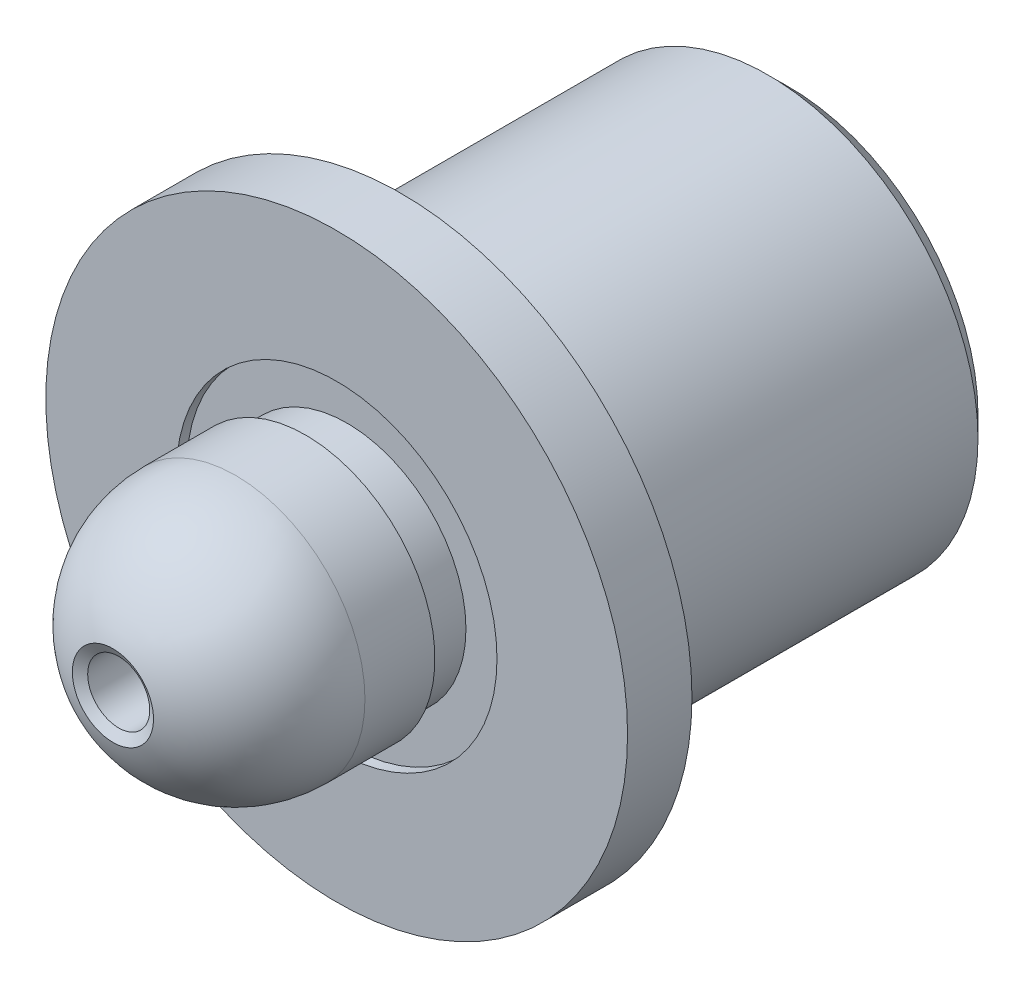
ISO-10303-21;
HEADER;
FILE_DESCRIPTION(('STEP AP214'),'2;1');
FILE_NAME('part.step','',(''),(''),'','','');
FILE_SCHEMA(('AUTOMOTIVE_DESIGN { 1 0 10303 214 1 1 1 1 }'));
ENDSEC;
DATA;
#1=APPLICATION_CONTEXT('core data for automotive mechanical design processes');
#2=APPLICATION_PROTOCOL_DEFINITION('international standard','automotive_design',2000,#1);
#3=PRODUCT_CONTEXT('',#1,'mechanical');
#4=PRODUCT('Part','Part','',(#3));
#5=PRODUCT_RELATED_PRODUCT_CATEGORY('part','',(#4));
#6=PRODUCT_DEFINITION_FORMATION('','',#4);
#7=PRODUCT_DEFINITION_CONTEXT('part definition',#1,'design');
#8=PRODUCT_DEFINITION('design','',#6,#7);
#9=PRODUCT_DEFINITION_SHAPE('','',#8);
#10=(LENGTH_UNIT() NAMED_UNIT(*) SI_UNIT(.MILLI.,.METRE.));
#11=(NAMED_UNIT(*) PLANE_ANGLE_UNIT() SI_UNIT($,.RADIAN.));
#12=(NAMED_UNIT(*) SI_UNIT($,.STERADIAN.) SOLID_ANGLE_UNIT());
#13=UNCERTAINTY_MEASURE_WITH_UNIT(LENGTH_MEASURE(1.E-05),#10,'distance_accuracy_value','');
#14=(GEOMETRIC_REPRESENTATION_CONTEXT(3) GLOBAL_UNCERTAINTY_ASSIGNED_CONTEXT((#13)) GLOBAL_UNIT_ASSIGNED_CONTEXT((#10,
#11,#12)) REPRESENTATION_CONTEXT('',''));
#15=CARTESIAN_POINT('',(0.,0.,0.));
#16=DIRECTION('',(0.,0.,1.));
#17=DIRECTION('',(1.,0.,0.));
#18=AXIS2_PLACEMENT_3D('',#15,#16,#17);
#19=CARTESIAN_POINT('',(0.,0.,13.5865460807241));
#20=DIRECTION('',(0.,0.,1.));
#21=DIRECTION('',(0.,1.,0.));
#22=AXIS2_PLACEMENT_3D('',#19,#20,#21);
#23=SPHERICAL_SURFACE('',#22,3.175);
#24=CARTESIAN_POINT('',(0.,0.,16.6008963569466));
#25=DIRECTION('',(0.,0.,-1.));
#26=DIRECTION('',(-1.,0.,0.));
#27=AXIS2_PLACEMENT_3D('',#24,#25,#26);
#28=CIRCLE('',#27,0.997154658133342);
#29=CARTESIAN_POINT('',(-0.997154658133342,0.,16.6008963569466));
#30=VERTEX_POINT('',#29);
#31=EDGE_CURVE('E10',#30,#30,#28,.T.);
#32=ORIENTED_EDGE('',*,*,#31,.T.);
#33=EDGE_LOOP('',(#32));
#34=FACE_BOUND('',#33,.T.);
#35=CARTESIAN_POINT('',(0.,0.,13.5865460807241));
#36=DIRECTION('',(0.,0.,1.));
#37=DIRECTION('',(1.,0.,0.));
#38=AXIS2_PLACEMENT_3D('',#35,#36,#37);
#39=CIRCLE('',#38,3.175);
#40=CARTESIAN_POINT('',(3.175,0.,13.5865460807241));
#41=VERTEX_POINT('',#40);
#42=EDGE_CURVE('E70',#41,#41,#39,.T.);
#43=ORIENTED_EDGE('',*,*,#42,.T.);
#44=EDGE_LOOP('',(#43));
#45=FACE_BOUND('',#44,.T.);
#46=ADVANCED_FACE('F32',(#34,#45),#23,.T.);
#47=CARTESIAN_POINT('',(0.,5.159375,9.525));
#48=DIRECTION('',(0.,0.,1.));
#49=DIRECTION('',(1.,0.,0.));
#50=AXIS2_PLACEMENT_3D('',#47,#48,#49);
#51=PLANE('',#50);
#52=CARTESIAN_POINT('',(0.,0.,9.525));
#53=DIRECTION('',(0.,0.,1.));
#54=DIRECTION('',(1.,0.,0.));
#55=AXIS2_PLACEMENT_3D('',#52,#53,#54);
#56=CIRCLE('',#55,7.14375);
#57=CARTESIAN_POINT('',(7.14375,0.,9.525));
#58=VERTEX_POINT('',#57);
#59=EDGE_CURVE('E58',#58,#58,#56,.T.);
#60=ORIENTED_EDGE('',*,*,#59,.F.);
#61=EDGE_LOOP('',(#60));
#62=FACE_BOUND('',#61,.T.);
#63=CARTESIAN_POINT('',(0.,0.,9.525));
#64=DIRECTION('',(0.,0.,1.));
#65=DIRECTION('',(1.,0.,0.));
#66=AXIS2_PLACEMENT_3D('',#63,#64,#65);
#67=CIRCLE('',#66,5.921375);
#68=CARTESIAN_POINT('',(5.921375,0.,9.525));
#69=VERTEX_POINT('',#68);
#70=EDGE_CURVE('E63',#69,#69,#67,.F.);
#71=ORIENTED_EDGE('',*,*,#70,.F.);
#72=EDGE_LOOP('',(#71));
#73=FACE_BOUND('',#72,.T.);
#74=ADVANCED_FACE('F118',(#62,#73),#51,.F.);
#75=CARTESIAN_POINT('',(0.,7.14375,11.10615));
#76=DIRECTION('',(0.,0.,-1.));
#77=DIRECTION('',(-1.,0.,0.));
#78=AXIS2_PLACEMENT_3D('',#75,#76,#77);
#79=PLANE('',#78);
#80=CARTESIAN_POINT('',(0.,0.,11.10615));
#81=DIRECTION('',(0.,0.,1.));
#82=DIRECTION('',(1.,0.,0.));
#83=AXIS2_PLACEMENT_3D('',#80,#81,#82);
#84=CIRCLE('',#83,7.14375);
#85=CARTESIAN_POINT('',(7.14375,0.,11.10615));
#86=VERTEX_POINT('',#85);
#87=EDGE_CURVE('E77',#86,#86,#84,.T.);
#88=ORIENTED_EDGE('',*,*,#87,.T.);
#89=EDGE_LOOP('',(#88));
#90=FACE_BOUND('',#89,.T.);
#91=CARTESIAN_POINT('',(0.,0.,11.10615));
#92=DIRECTION('',(0.,0.,-1.));
#93=DIRECTION('',(-1.,0.,0.));
#94=AXIS2_PLACEMENT_3D('',#91,#92,#93);
#95=CIRCLE('',#94,3.937);
#96=CARTESIAN_POINT('',(-3.937,0.,11.10615));
#97=VERTEX_POINT('',#96);
#98=EDGE_CURVE('E67',#97,#97,#95,.F.);
#99=ORIENTED_EDGE('',*,*,#98,.F.);
#100=EDGE_LOOP('',(#99));
#101=FACE_BOUND('',#100,.T.);
#102=ADVANCED_FACE('F123',(#90,#101),#79,.F.);
#103=CARTESIAN_POINT('',(0.,0.,17.4309411747939));
#104=DIRECTION('',(0.,0.,1.));
#105=DIRECTION('',(1.,0.,0.));
#106=AXIS2_PLACEMENT_3D('',#103,#104,#105);
#107=CYLINDRICAL_SURFACE('',#106,7.14375);
#108=ORIENTED_EDGE('',*,*,#87,.F.);
#109=EDGE_LOOP('',(#108));
#110=FACE_BOUND('',#109,.T.);
#111=ORIENTED_EDGE('',*,*,#59,.T.);
#112=EDGE_LOOP('',(#111));
#113=FACE_BOUND('',#112,.T.);
#114=ADVANCED_FACE('F139',(#110,#113),#107,.T.);
#115=CARTESIAN_POINT('',(0.,0.,17.4309411747939));
#116=DIRECTION('',(0.,0.,1.));
#117=DIRECTION('',(1.,0.,0.));
#118=AXIS2_PLACEMENT_3D('',#115,#116,#117);
#119=CYLINDRICAL_SURFACE('',#118,3.937);
#120=CARTESIAN_POINT('',(0.,0.,10.85215));
#121=DIRECTION('',(0.,0.,1.));
#122=DIRECTION('',(1.,0.,0.));
#123=AXIS2_PLACEMENT_3D('',#120,#121,#122);
#124=CIRCLE('',#123,3.937);
#125=CARTESIAN_POINT('',(3.937,0.,10.85215));
#126=VERTEX_POINT('',#125);
#127=EDGE_CURVE('E74',#126,#126,#124,.T.);
#128=ORIENTED_EDGE('',*,*,#127,.F.);
#129=EDGE_LOOP('',(#128));
#130=FACE_BOUND('',#129,.T.);
#131=ORIENTED_EDGE('',*,*,#98,.T.);
#132=EDGE_LOOP('',(#131));
#133=FACE_BOUND('',#132,.T.);
#134=ADVANCED_FACE('F142',(#130,#133),#119,.F.);
#135=CARTESIAN_POINT('',(0.,2.921,11.86815));
#136=DIRECTION('',(0.,0.,-1.));
#137=DIRECTION('',(-1.,0.,0.));
#138=AXIS2_PLACEMENT_3D('',#135,#136,#137);
#139=PLANE('',#138);
#140=CARTESIAN_POINT('',(0.,0.,11.86815));
#141=DIRECTION('',(0.,0.,1.));
#142=DIRECTION('',(1.,0.,0.));
#143=AXIS2_PLACEMENT_3D('',#140,#141,#142);
#144=CIRCLE('',#143,2.921);
#145=CARTESIAN_POINT('',(2.921,0.,11.86815));
#146=VERTEX_POINT('',#145);
#147=EDGE_CURVE('E62',#146,#146,#144,.T.);
#148=ORIENTED_EDGE('',*,*,#147,.T.);
#149=EDGE_LOOP('',(#148));
#150=FACE_BOUND('',#149,.T.);
#151=CARTESIAN_POINT('',(0.,0.,11.86815));
#152=DIRECTION('',(0.,0.,-1.));
#153=DIRECTION('',(-1.,0.,0.));
#154=AXIS2_PLACEMENT_3D('',#151,#152,#153);
#155=CIRCLE('',#154,3.175);
#156=CARTESIAN_POINT('',(-3.175,0.,11.86815));
#157=VERTEX_POINT('',#156);
#158=EDGE_CURVE('E71',#157,#157,#155,.T.);
#159=ORIENTED_EDGE('',*,*,#158,.T.);
#160=EDGE_LOOP('',(#159));
#161=FACE_BOUND('',#160,.T.);
#162=ADVANCED_FACE('F129',(#150,#161),#139,.T.);
#163=CARTESIAN_POINT('',(0.,2.921,10.85215));
#164=DIRECTION('',(0.,0.,1.));
#165=DIRECTION('',(1.,0.,0.));
#166=AXIS2_PLACEMENT_3D('',#163,#164,#165);
#167=PLANE('',#166);
#168=ORIENTED_EDGE('',*,*,#127,.T.);
#169=EDGE_LOOP('',(#168));
#170=FACE_BOUND('',#169,.T.);
#171=CARTESIAN_POINT('',(0.,0.,10.85215));
#172=DIRECTION('',(0.,0.,1.));
#173=DIRECTION('',(1.,0.,0.));
#174=AXIS2_PLACEMENT_3D('',#171,#172,#173);
#175=CIRCLE('',#174,2.921);
#176=CARTESIAN_POINT('',(2.921,0.,10.85215));
#177=VERTEX_POINT('',#176);
#178=EDGE_CURVE('E84',#177,#177,#175,.T.);
#179=ORIENTED_EDGE('',*,*,#178,.F.);
#180=EDGE_LOOP('',(#179));
#181=FACE_BOUND('',#180,.T.);
#182=ADVANCED_FACE('F189',(#170,#181),#167,.T.);
#183=CARTESIAN_POINT('',(0.,0.,17.4309411747939));
#184=DIRECTION('',(0.,0.,1.));
#185=DIRECTION('',(1.,0.,0.));
#186=AXIS2_PLACEMENT_3D('',#183,#184,#185);
#187=CYLINDRICAL_SURFACE('',#186,2.921);
#188=ORIENTED_EDGE('',*,*,#178,.T.);
#189=EDGE_LOOP('',(#188));
#190=FACE_BOUND('',#189,.T.);
#191=ORIENTED_EDGE('',*,*,#147,.F.);
#192=EDGE_LOOP('',(#191));
#193=FACE_BOUND('',#192,.T.);
#194=ADVANCED_FACE('F135',(#190,#193),#187,.T.);
#195=CARTESIAN_POINT('',(0.,0.,17.4309411747939));
#196=DIRECTION('',(0.,0.,1.));
#197=DIRECTION('',(1.,0.,0.));
#198=AXIS2_PLACEMENT_3D('',#195,#196,#197);
#199=CYLINDRICAL_SURFACE('',#198,3.175);
#200=ORIENTED_EDGE('',*,*,#42,.F.);
#201=EDGE_LOOP('',(#200));
#202=FACE_BOUND('',#201,.T.);
#203=ORIENTED_EDGE('',*,*,#158,.F.);
#204=EDGE_LOOP('',(#203));
#205=FACE_BOUND('',#204,.T.);
#206=ADVANCED_FACE('F131',(#202,#205),#199,.T.);
#207=CARTESIAN_POINT('',(0.,5.921375,8.763));
#208=DIRECTION('',(0.,0.,1.));
#209=DIRECTION('',(1.,0.,0.));
#210=AXIS2_PLACEMENT_3D('',#207,#208,#209);
#211=PLANE('',#210);
#212=CARTESIAN_POINT('',(0.,0.,8.763));
#213=DIRECTION('',(0.,0.,1.));
#214=DIRECTION('',(1.,0.,0.));
#215=AXIS2_PLACEMENT_3D('',#212,#213,#214);
#216=CIRCLE('',#215,4.905375);
#217=CARTESIAN_POINT('',(4.905375,0.,8.763));
#218=VERTEX_POINT('',#217);
#219=EDGE_CURVE('E91',#218,#218,#216,.T.);
#220=ORIENTED_EDGE('',*,*,#219,.F.);
#221=EDGE_LOOP('',(#220));
#222=FACE_BOUND('',#221,.T.);
#223=CARTESIAN_POINT('',(0.,0.,8.763));
#224=DIRECTION('',(0.,0.,1.));
#225=DIRECTION('',(1.,0.,0.));
#226=AXIS2_PLACEMENT_3D('',#223,#224,#225);
#227=CIRCLE('',#226,5.159375);
#228=CARTESIAN_POINT('',(5.159375,0.,8.763));
#229=VERTEX_POINT('',#228);
#230=EDGE_CURVE('E59',#229,#229,#227,.T.);
#231=ORIENTED_EDGE('',*,*,#230,.T.);
#232=EDGE_LOOP('',(#231));
#233=FACE_BOUND('',#232,.T.);
#234=ADVANCED_FACE('F134',(#222,#233),#211,.T.);
#235=CARTESIAN_POINT('',(0.,0.,17.4309411747939));
#236=DIRECTION('',(0.,0.,1.));
#237=DIRECTION('',(1.,0.,0.));
#238=AXIS2_PLACEMENT_3D('',#235,#236,#237);
#239=CYLINDRICAL_SURFACE('',#238,5.921375);
#240=CARTESIAN_POINT('',(0.,0.,9.779));
#241=DIRECTION('',(0.,0.,1.));
#242=DIRECTION('',(1.,0.,0.));
#243=AXIS2_PLACEMENT_3D('',#240,#241,#242);
#244=CIRCLE('',#243,5.921375);
#245=CARTESIAN_POINT('',(5.921375,0.,9.779));
#246=VERTEX_POINT('',#245);
#247=EDGE_CURVE('E94',#246,#246,#244,.T.);
#248=ORIENTED_EDGE('',*,*,#247,.T.);
#249=EDGE_LOOP('',(#248));
#250=FACE_BOUND('',#249,.T.);
#251=ORIENTED_EDGE('',*,*,#70,.T.);
#252=EDGE_LOOP('',(#251));
#253=FACE_BOUND('',#252,.T.);
#254=ADVANCED_FACE('F170',(#250,#253),#239,.F.);
#255=CARTESIAN_POINT('',(0.,5.921375,9.779));
#256=DIRECTION('',(0.,0.,-1.));
#257=DIRECTION('',(-1.,0.,0.));
#258=AXIS2_PLACEMENT_3D('',#255,#256,#257);
#259=PLANE('',#258);
#260=CARTESIAN_POINT('',(0.,0.,9.779));
#261=DIRECTION('',(0.,0.,1.));
#262=DIRECTION('',(1.,0.,0.));
#263=AXIS2_PLACEMENT_3D('',#260,#261,#262);
#264=CIRCLE('',#263,4.905375);
#265=CARTESIAN_POINT('',(4.905375,0.,9.779));
#266=VERTEX_POINT('',#265);
#267=EDGE_CURVE('E66',#266,#266,#264,.T.);
#268=ORIENTED_EDGE('',*,*,#267,.T.);
#269=EDGE_LOOP('',(#268));
#270=FACE_BOUND('',#269,.T.);
#271=ORIENTED_EDGE('',*,*,#247,.F.);
#272=EDGE_LOOP('',(#271));
#273=FACE_BOUND('',#272,.T.);
#274=ADVANCED_FACE('F176',(#270,#273),#259,.T.);
#275=CARTESIAN_POINT('',(0.,0.,17.4309411747939));
#276=DIRECTION('',(0.,0.,1.));
#277=DIRECTION('',(1.,0.,0.));
#278=AXIS2_PLACEMENT_3D('',#275,#276,#277);
#279=CYLINDRICAL_SURFACE('',#278,4.905375);
#280=ORIENTED_EDGE('',*,*,#219,.T.);
#281=EDGE_LOOP('',(#280));
#282=FACE_BOUND('',#281,.T.);
#283=ORIENTED_EDGE('',*,*,#267,.F.);
#284=EDGE_LOOP('',(#283));
#285=FACE_BOUND('',#284,.T.);
#286=ADVANCED_FACE('F153',(#282,#285),#279,.T.);
#287=CARTESIAN_POINT('',(0.,0.,0.));
#288=DIRECTION('',(0.,0.,1.));
#289=DIRECTION('',(1.,0.,0.));
#290=AXIS2_PLACEMENT_3D('',#287,#288,#289);
#291=PLANE('',#290);
#292=CARTESIAN_POINT('',(0.,0.,0.));
#293=DIRECTION('',(0.,0.,1.));
#294=DIRECTION('',(1.,0.,0.));
#295=AXIS2_PLACEMENT_3D('',#292,#293,#294);
#296=CIRCLE('',#295,1.016);
#297=CARTESIAN_POINT('',(-1.016,0.,0.));
#298=VERTEX_POINT('',#297);
#299=EDGE_CURVE('E43',#298,#298,#296,.T.);
#300=ORIENTED_EDGE('',*,*,#299,.T.);
#301=EDGE_LOOP('',(#300));
#302=FACE_BOUND('',#301,.T.);
#303=CARTESIAN_POINT('',(0.,0.,0.));
#304=DIRECTION('',(0.,0.,1.));
#305=DIRECTION('',(1.,0.,0.));
#306=AXIS2_PLACEMENT_3D('',#303,#304,#305);
#307=CIRCLE('',#306,4.6434375);
#308=CARTESIAN_POINT('',(4.6434375,0.,0.));
#309=VERTEX_POINT('',#308);
#310=EDGE_CURVE('E52',#309,#309,#307,.F.);
#311=ORIENTED_EDGE('',*,*,#310,.T.);
#312=EDGE_LOOP('',(#311));
#313=FACE_BOUND('',#312,.T.);
#314=ADVANCED_FACE('F149',(#302,#313),#291,.F.);
#315=CARTESIAN_POINT('',(0.,0.,17.4309411747939));
#316=DIRECTION('',(0.,0.,1.));
#317=DIRECTION('',(1.,0.,0.));
#318=AXIS2_PLACEMENT_3D('',#315,#316,#317);
#319=CYLINDRICAL_SURFACE('',#318,5.159375);
#320=CARTESIAN_POINT('',(0.,0.,0.515937499999997));
#321=DIRECTION('',(0.,0.,1.));
#322=DIRECTION('',(1.,0.,0.));
#323=AXIS2_PLACEMENT_3D('',#320,#321,#322);
#324=CIRCLE('',#323,5.159375);
#325=CARTESIAN_POINT('',(5.159375,0.,0.515937499999997));
#326=VERTEX_POINT('',#325);
#327=EDGE_CURVE('E55',#326,#326,#324,.T.);
#328=ORIENTED_EDGE('',*,*,#327,.T.);
#329=EDGE_LOOP('',(#328));
#330=FACE_BOUND('',#329,.T.);
#331=ORIENTED_EDGE('',*,*,#230,.F.);
#332=EDGE_LOOP('',(#331));
#333=FACE_BOUND('',#332,.T.);
#334=ADVANCED_FACE('F145',(#330,#333),#319,.T.);
#335=CARTESIAN_POINT('',(0.,0.,0.515937499999997));
#336=DIRECTION('',(0.,0.,1.));
#337=DIRECTION('',(1.,0.,0.));
#338=AXIS2_PLACEMENT_3D('',#335,#336,#337);
#339=CONICAL_SURFACE('',#338,5.159375,0.785398163397449);
#340=ORIENTED_EDGE('',*,*,#310,.F.);
#341=EDGE_LOOP('',(#340));
#342=FACE_BOUND('',#341,.T.);
#343=ORIENTED_EDGE('',*,*,#327,.F.);
#344=EDGE_LOOP('',(#343));
#345=FACE_BOUND('',#344,.T.);
#346=ADVANCED_FACE('F148',(#342,#345),#339,.T.);
#347=CARTESIAN_POINT('',(0.,0.,2.54));
#348=DIRECTION('',(0.,0.,-1.));
#349=DIRECTION('',(-1.,0.,0.));
#350=AXIS2_PLACEMENT_3D('',#347,#348,#349);
#351=CYLINDRICAL_SURFACE('',#350,0.762);
#352=CARTESIAN_POINT('',(0.,0.,0.254000000000002));
#353=DIRECTION('',(0.,0.,1.));
#354=DIRECTION('',(1.,0.,0.));
#355=AXIS2_PLACEMENT_3D('',#352,#353,#354);
#356=CIRCLE('',#355,0.762);
#357=CARTESIAN_POINT('',(-0.762,0.,0.254000000000002));
#358=VERTEX_POINT('',#357);
#359=EDGE_CURVE('E47',#358,#358,#356,.F.);
#360=ORIENTED_EDGE('',*,*,#359,.T.);
#361=EDGE_LOOP('',(#360));
#362=FACE_BOUND('',#361,.T.);
#363=CARTESIAN_POINT('',(0.,0.,2.54));
#364=DIRECTION('',(0.,0.,-1.));
#365=DIRECTION('',(-1.,0.,0.));
#366=AXIS2_PLACEMENT_3D('',#363,#364,#365);
#367=CIRCLE('',#366,0.762);
#368=CARTESIAN_POINT('',(-0.762,0.,2.54));
#369=VERTEX_POINT('',#368);
#370=EDGE_CURVE('E97',#369,#369,#367,.T.);
#371=ORIENTED_EDGE('',*,*,#370,.F.);
#372=EDGE_LOOP('',(#371));
#373=FACE_BOUND('',#372,.T.);
#374=ADVANCED_FACE('F156',(#362,#373),#351,.F.);
#375=CARTESIAN_POINT('',(0.,0.,2.54));
#376=DIRECTION('',(0.,0.,-1.));
#377=DIRECTION('',(-1.,0.,0.));
#378=AXIS2_PLACEMENT_3D('',#375,#376,#377);
#379=PLANE('',#378);
#380=ORIENTED_EDGE('',*,*,#370,.T.);
#381=EDGE_LOOP('',(#380));
#382=FACE_BOUND('',#381,.T.);
#383=ADVANCED_FACE('F115',(#382),#379,.T.);
#384=CARTESIAN_POINT('',(0.,0.,14.2215460807241));
#385=DIRECTION('',(0.,0.,1.));
#386=DIRECTION('',(1.,0.,0.));
#387=AXIS2_PLACEMENT_3D('',#384,#385,#386);
#388=CYLINDRICAL_SURFACE('',#387,0.762);
#389=CARTESIAN_POINT('',(0.,0.,16.4589666438268));
#390=DIRECTION('',(0.,0.,-1.));
#391=DIRECTION('',(-1.,0.,0.));
#392=AXIS2_PLACEMENT_3D('',#389,#390,#391);
#393=CIRCLE('',#392,0.762);
#394=CARTESIAN_POINT('',(-0.762,0.,16.4589666438268));
#395=VERTEX_POINT('',#394);
#396=EDGE_CURVE('E39',#395,#395,#393,.F.);
#397=ORIENTED_EDGE('',*,*,#396,.T.);
#398=EDGE_LOOP('',(#397));
#399=FACE_BOUND('',#398,.T.);
#400=CARTESIAN_POINT('',(0.,0.,14.2215460807241));
#401=DIRECTION('',(0.,0.,-1.));
#402=DIRECTION('',(-1.,0.,0.));
#403=AXIS2_PLACEMENT_3D('',#400,#401,#402);
#404=CIRCLE('',#403,0.762);
#405=CARTESIAN_POINT('',(-0.762,0.,14.2215460807241));
#406=VERTEX_POINT('',#405);
#407=EDGE_CURVE('E100',#406,#406,#404,.T.);
#408=ORIENTED_EDGE('',*,*,#407,.T.);
#409=EDGE_LOOP('',(#408));
#410=FACE_BOUND('',#409,.T.);
#411=ADVANCED_FACE('F104',(#399,#410),#388,.F.);
#412=CARTESIAN_POINT('',(0.,0.,14.2215460807241));
#413=DIRECTION('',(0.,0.,1.));
#414=DIRECTION('',(-1.,0.,0.));
#415=AXIS2_PLACEMENT_3D('',#412,#413,#414);
#416=PLANE('',#415);
#417=ORIENTED_EDGE('',*,*,#407,.F.);
#418=EDGE_LOOP('',(#417));
#419=FACE_BOUND('',#418,.T.);
#420=ADVANCED_FACE('F106',(#419),#416,.T.);
#421=CARTESIAN_POINT('',(0.,0.,0.254000000000002));
#422=DIRECTION('',(0.,0.,-1.));
#423=DIRECTION('',(-1.,0.,0.));
#424=AXIS2_PLACEMENT_3D('',#421,#422,#423);
#425=CONICAL_SURFACE('',#424,0.762,0.785398163397443);
#426=CARTESIAN_POINT('',(-1.016,0.,0.));
#427=CARTESIAN_POINT('',(-1.01335416666667,0.,0.00264583333333329));
#428=CARTESIAN_POINT('',(-1.01070833333333,0.,0.00529166666666666));
#429=CARTESIAN_POINT('',(-1.00541666666667,0.,0.0105833333333334));
#430=CARTESIAN_POINT('',(-1.00277083333333,0.,0.0132291666666667));
#431=CARTESIAN_POINT('',(-0.997479166666666,0.,0.0185208333333334));
#432=CARTESIAN_POINT('',(-0.994833333333333,0.,0.0211666666666668));
#433=CARTESIAN_POINT('',(-0.989541666666666,0.,0.0264583333333335));
#434=CARTESIAN_POINT('',(-0.986895833333333,0.,0.0291041666666668));
#435=CARTESIAN_POINT('',(-0.981604166666666,0.,0.0343958333333335));
#436=CARTESIAN_POINT('',(-0.978958333333333,0.,0.0370416666666669));
#437=CARTESIAN_POINT('',(-0.973666666666666,0.,0.0423333333333336));
#438=CARTESIAN_POINT('',(-0.971020833333333,0.,0.044979166666667));
#439=CARTESIAN_POINT('',(-0.965729166666666,0.,0.0502708333333337));
#440=CARTESIAN_POINT('',(-0.963083333333333,0.,0.052916666666667));
#441=CARTESIAN_POINT('',(-0.957791666666666,0.,0.0582083333333337));
#442=CARTESIAN_POINT('',(-0.955145833333333,0.,0.0608541666666671));
#443=CARTESIAN_POINT('',(-0.949854166666666,0.,0.0661458333333338));
#444=CARTESIAN_POINT('',(-0.947208333333333,0.,0.0687916666666672));
#445=CARTESIAN_POINT('',(-0.941916666666666,0.,0.0740833333333339));
#446=CARTESIAN_POINT('',(-0.939270833333333,0.,0.0767291666666672));
#447=CARTESIAN_POINT('',(-0.933979166666666,0.,0.0820208333333339));
#448=CARTESIAN_POINT('',(-0.931333333333333,0.,0.0846666666666673));
#449=CARTESIAN_POINT('',(-0.926041666666666,0.,0.089958333333334));
#450=CARTESIAN_POINT('',(-0.923395833333333,0.,0.0926041666666674));
#451=CARTESIAN_POINT('',(-0.918104166666666,0.,0.0978958333333341));
#452=CARTESIAN_POINT('',(-0.915458333333333,0.,0.100541666666667));
#453=CARTESIAN_POINT('',(-0.910166666666666,0.,0.105833333333334));
#454=CARTESIAN_POINT('',(-0.907520833333333,0.,0.108479166666667));
#455=CARTESIAN_POINT('',(-0.902229166666667,0.,0.113770833333334));
#456=CARTESIAN_POINT('',(-0.899583333333333,0.,0.116416666666668));
#457=CARTESIAN_POINT('',(-0.894291666666666,0.,0.121708333333334));
#458=CARTESIAN_POINT('',(-0.891645833333333,0.,0.124354166666668));
#459=CARTESIAN_POINT('',(-0.886354166666666,0.,0.129645833333334));
#460=CARTESIAN_POINT('',(-0.883708333333333,0.,0.132291666666668));
#461=CARTESIAN_POINT('',(-0.878416666666667,0.,0.137583333333334));
#462=CARTESIAN_POINT('',(-0.875770833333333,0.,0.140229166666668));
#463=CARTESIAN_POINT('',(-0.870479166666667,0.,0.145520833333334));
#464=CARTESIAN_POINT('',(-0.867833333333333,0.,0.148166666666668));
#465=CARTESIAN_POINT('',(-0.862541666666667,0.,0.153458333333335));
#466=CARTESIAN_POINT('',(-0.859895833333333,0.,0.156104166666668));
#467=CARTESIAN_POINT('',(-0.854604166666667,0.,0.161395833333335));
#468=CARTESIAN_POINT('',(-0.851958333333333,0.,0.164041666666668));
#469=CARTESIAN_POINT('',(-0.846666666666667,0.,0.169333333333335));
#470=CARTESIAN_POINT('',(-0.844020833333333,0.,0.171979166666668));
#471=CARTESIAN_POINT('',(-0.838729166666667,0.,0.177270833333335));
#472=CARTESIAN_POINT('',(-0.836083333333333,0.,0.179916666666668));
#473=CARTESIAN_POINT('',(-0.830791666666667,0.,0.185208333333335));
#474=CARTESIAN_POINT('',(-0.828145833333333,0.,0.187854166666668));
#475=CARTESIAN_POINT('',(-0.822854166666667,0.,0.193145833333335));
#476=CARTESIAN_POINT('',(-0.820208333333333,0.,0.195791666666668));
#477=CARTESIAN_POINT('',(-0.814916666666667,0.,0.201083333333335));
#478=CARTESIAN_POINT('',(-0.812270833333333,0.,0.203729166666668));
#479=CARTESIAN_POINT('',(-0.806979166666667,0.,0.209020833333335));
#480=CARTESIAN_POINT('',(-0.804333333333333,0.,0.211666666666668));
#481=CARTESIAN_POINT('',(-0.799041666666667,0.,0.216958333333335));
#482=CARTESIAN_POINT('',(-0.796395833333333,0.,0.219604166666668));
#483=CARTESIAN_POINT('',(-0.791104166666667,0.,0.224895833333335));
#484=CARTESIAN_POINT('',(-0.788458333333333,0.,0.227541666666668));
#485=CARTESIAN_POINT('',(-0.783166666666667,0.,0.232833333333335));
#486=CARTESIAN_POINT('',(-0.780520833333333,0.,0.235479166666669));
#487=CARTESIAN_POINT('',(-0.775229166666667,0.,0.240770833333335));
#488=CARTESIAN_POINT('',(-0.772583333333333,0.,0.243416666666669));
#489=CARTESIAN_POINT('',(-0.767291666666667,0.,0.248708333333335));
#490=CARTESIAN_POINT('',(-0.764645833333333,0.,0.251354166666669));
#491=CARTESIAN_POINT('',(-0.762,0.,0.254000000000002));
#492=B_SPLINE_CURVE_WITH_KNOTS('',3,(#426,#427,#428,#429,#430,#431,#432,#433,#434,#435,#436,
#437,#438,#439,#440,#441,#442,#443,#444,#445,#446,#447,#448,#449,#450,#451,#452,#453,#454,#455,
#456,#457,#458,#459,#460,#461,#462,#463,#464,#465,#466,#467,#468,#469,#470,#471,#472,#473,#474,
#475,#476,#477,#478,#479,#480,#481,#482,#483,#484,#485,#486,#487,#488,#489,#490,#491),
.UNSPECIFIED.,.F.,.F.,(4,2,2,2,2,2,2,2,2,2,2,2,2,2,2,2,2,2,2,2,2,2,2,2,2,2,2,2,2,2,2,2,4),(0.,
0.0112253201513364,0.0224506403026728,0.0336759604540094,0.0449012806053458,0.0561266007566823,
0.0673519209080188,0.0785772410593553,0.0898025612106917,0.101027881362028,0.112253201513365,
0.123478521664701,0.134703841816038,0.145929161967374,0.157154482118711,0.168379802270047,
0.179605122421384,0.19083044257272,0.202055762724057,0.213281082875393,0.224506403026729,
0.235731723178066,0.246957043329402,0.258182363480739,0.269407683632075,0.280633003783412,
0.291858323934748,0.303083644086085,0.314308964237421,0.325534284388758,0.336759604540094,
0.347984924691431,0.359210244842767),.UNSPECIFIED.);
#493=EDGE_CURVE('BSEAM108',#298,#358,#492,.T.);
#494=ORIENTED_EDGE('',*,*,#299,.F.);
#495=ORIENTED_EDGE('',*,*,#359,.F.);
#496=ORIENTED_EDGE('',*,*,#493,.T.);
#497=ORIENTED_EDGE('',*,*,#493,.F.);
#498=EDGE_LOOP('',(#494,#496,#495,#497));
#499=FACE_BOUND('',#498,.T.);
#500=ADVANCED_FACE('F108',(#499),#425,.F.);
#501=CARTESIAN_POINT('',(0.,0.,16.4589666438268));
#502=DIRECTION('',(0.,0.,1.));
#503=DIRECTION('',(1.,0.,0.));
#504=AXIS2_PLACEMENT_3D('',#501,#502,#503);
#505=CONICAL_SURFACE('',#504,0.762,1.02776401443641);
#506=ORIENTED_EDGE('',*,*,#31,.F.);
#507=EDGE_LOOP('',(#506));
#508=FACE_BOUND('',#507,.T.);
#509=ORIENTED_EDGE('',*,*,#396,.F.);
#510=EDGE_LOOP('',(#509));
#511=FACE_BOUND('',#510,.T.);
#512=ADVANCED_FACE('F34',(#508,#511),#505,.F.);
#513=CLOSED_SHELL('',(#46,#74,#102,#114,#134,#162,#182,#194,#206,#234,#254,#274,#286,#314,#334,
#346,#374,#383,#411,#420,#500,#512));
#514=MANIFOLD_SOLID_BREP('B2',#513);
#515=ADVANCED_BREP_SHAPE_REPRESENTATION('',(#18,#514),#14);
#516=SHAPE_DEFINITION_REPRESENTATION(#9,#515);
ENDSEC;
END-ISO-10303-21;
